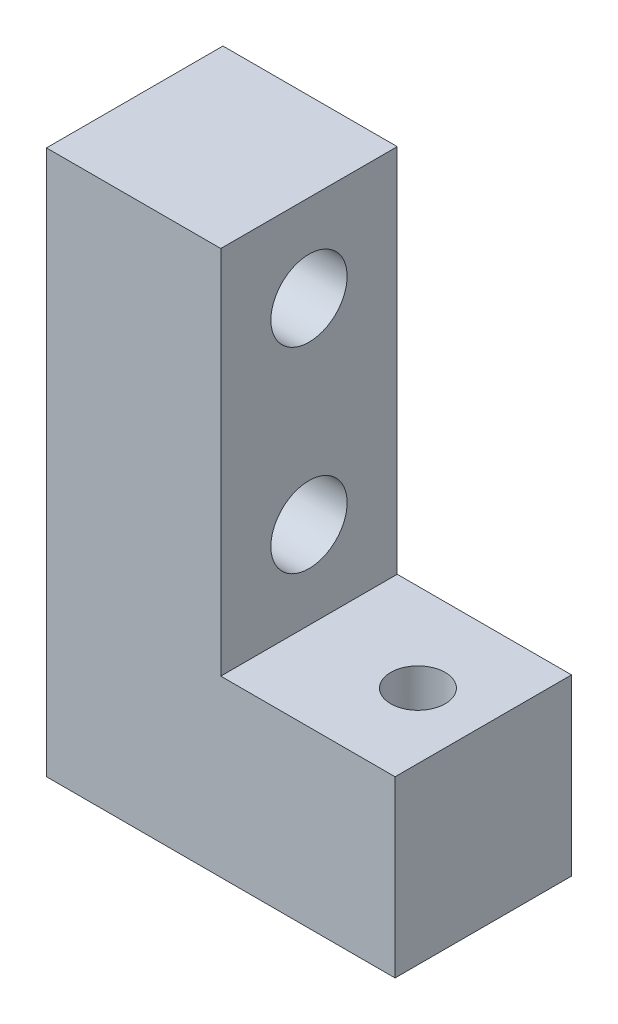
ISO-10303-21;
HEADER;
FILE_DESCRIPTION(('STEP AP214'),'2;1');
FILE_NAME('part.step','',(''),(''),'','','');
FILE_SCHEMA(('AUTOMOTIVE_DESIGN { 1 0 10303 214 1 1 1 1 }'));
ENDSEC;
DATA;
#1=APPLICATION_CONTEXT('core data for automotive mechanical design processes');
#2=APPLICATION_PROTOCOL_DEFINITION('international standard','automotive_design',2000,#1);
#3=PRODUCT_CONTEXT('',#1,'mechanical');
#4=PRODUCT('Part','Part','',(#3));
#5=PRODUCT_RELATED_PRODUCT_CATEGORY('part','',(#4));
#6=PRODUCT_DEFINITION_FORMATION('','',#4);
#7=PRODUCT_DEFINITION_CONTEXT('part definition',#1,'design');
#8=PRODUCT_DEFINITION('design','',#6,#7);
#9=PRODUCT_DEFINITION_SHAPE('','',#8);
#10=(LENGTH_UNIT() NAMED_UNIT(*) SI_UNIT(.MILLI.,.METRE.));
#11=(NAMED_UNIT(*) PLANE_ANGLE_UNIT() SI_UNIT($,.RADIAN.));
#12=(NAMED_UNIT(*) SI_UNIT($,.STERADIAN.) SOLID_ANGLE_UNIT());
#13=UNCERTAINTY_MEASURE_WITH_UNIT(LENGTH_MEASURE(1.E-05),#10,'distance_accuracy_value','');
#14=(GEOMETRIC_REPRESENTATION_CONTEXT(3) GLOBAL_UNCERTAINTY_ASSIGNED_CONTEXT((#13)) GLOBAL_UNIT_ASSIGNED_CONTEXT((#10,
#11,#12)) REPRESENTATION_CONTEXT('',''));
#15=CARTESIAN_POINT('',(0.,0.,0.));
#16=DIRECTION('',(0.,0.,1.));
#17=DIRECTION('',(1.,0.,0.));
#18=AXIS2_PLACEMENT_3D('',#15,#16,#17);
#19=CARTESIAN_POINT('',(0.,0.,8.1));
#20=DIRECTION('',(1.,0.,0.));
#21=DIRECTION('',(0.,0.,-1.));
#22=AXIS2_PLACEMENT_3D('',#19,#20,#21);
#23=PLANE('',#22);
#24=CARTESIAN_POINT('',(0.,12.,4.05));
#25=DIRECTION('',(-1.,0.,0.));
#26=DIRECTION('',(0.,0.,1.));
#27=AXIS2_PLACEMENT_3D('',#24,#25,#26);
#28=CIRCLE('',#27,1.75);
#29=CARTESIAN_POINT('',(0.,12.,5.8));
#30=VERTEX_POINT('',#29);
#31=EDGE_CURVE('E144',#30,#30,#28,.T.);
#32=ORIENTED_EDGE('',*,*,#31,.F.);
#33=EDGE_LOOP('',(#32));
#34=FACE_BOUND('',#33,.T.);
#35=CARTESIAN_POINT('',(0.,21.,4.05));
#36=DIRECTION('',(-1.,0.,0.));
#37=DIRECTION('',(0.,0.,1.));
#38=AXIS2_PLACEMENT_3D('',#35,#36,#37);
#39=CIRCLE('',#38,1.75);
#40=CARTESIAN_POINT('',(0.,21.,5.8));
#41=VERTEX_POINT('',#40);
#42=EDGE_CURVE('E147',#41,#41,#39,.T.);
#43=ORIENTED_EDGE('',*,*,#42,.F.);
#44=EDGE_LOOP('',(#43));
#45=FACE_BOUND('',#44,.T.);
#46=DIRECTION('',(0.,-1.,0.));
#47=VECTOR('',#46,1.);
#48=CARTESIAN_POINT('',(0.,0.,0.));
#49=LINE('',#48,#47);
#50=CARTESIAN_POINT('',(0.,25.,0.));
#51=VERTEX_POINT('',#50);
#52=CARTESIAN_POINT('',(0.,0.,0.));
#53=VERTEX_POINT('',#52);
#54=EDGE_CURVE('E108',#51,#53,#49,.T.);
#55=ORIENTED_EDGE('',*,*,#54,.T.);
#56=DIRECTION('',(0.,0.,-1.));
#57=VECTOR('',#56,1.);
#58=CARTESIAN_POINT('',(0.,0.,8.1));
#59=LINE('',#58,#57);
#60=CARTESIAN_POINT('',(0.,0.,8.1));
#61=VERTEX_POINT('',#60);
#62=EDGE_CURVE('E11',#61,#53,#59,.T.);
#63=ORIENTED_EDGE('',*,*,#62,.F.);
#64=DIRECTION('',(0.,-1.,0.));
#65=VECTOR('',#64,1.);
#66=CARTESIAN_POINT('',(0.,0.,8.1));
#67=LINE('',#66,#65);
#68=CARTESIAN_POINT('',(0.,25.,8.1));
#69=VERTEX_POINT('',#68);
#70=EDGE_CURVE('E109',#69,#61,#67,.T.);
#71=ORIENTED_EDGE('',*,*,#70,.F.);
#72=DIRECTION('',(0.,0.,-1.));
#73=VECTOR('',#72,1.);
#74=CARTESIAN_POINT('',(0.,25.,8.1));
#75=LINE('',#74,#73);
#76=EDGE_CURVE('E118',#69,#51,#75,.T.);
#77=ORIENTED_EDGE('',*,*,#76,.T.);
#78=EDGE_LOOP('',(#55,#63,#71,#77));
#79=FACE_BOUND('',#78,.T.);
#80=ADVANCED_FACE('F33',(#34,#45,#79),#23,.F.);
#81=CARTESIAN_POINT('',(0.,0.,8.1));
#82=DIRECTION('',(0.,1.,0.));
#83=DIRECTION('',(0.,0.,1.));
#84=AXIS2_PLACEMENT_3D('',#81,#82,#83);
#85=PLANE('',#84);
#86=CARTESIAN_POINT('',(13.,0.,4.05));
#87=DIRECTION('',(0.,-1.,0.));
#88=DIRECTION('',(0.,0.,1.));
#89=AXIS2_PLACEMENT_3D('',#86,#87,#88);
#90=CIRCLE('',#89,1.25);
#91=CARTESIAN_POINT('',(13.,0.,5.3));
#92=VERTEX_POINT('',#91);
#93=EDGE_CURVE('E150',#92,#92,#90,.T.);
#94=ORIENTED_EDGE('',*,*,#93,.F.);
#95=EDGE_LOOP('',(#94));
#96=FACE_BOUND('',#95,.T.);
#97=CARTESIAN_POINT('',(3.,0.,4.05));
#98=DIRECTION('',(0.,-1.,0.));
#99=DIRECTION('',(0.,0.,-1.));
#100=AXIS2_PLACEMENT_3D('',#97,#98,#99);
#101=CIRCLE('',#100,1.25);
#102=CARTESIAN_POINT('',(3.,0.,2.8));
#103=VERTEX_POINT('',#102);
#104=EDGE_CURVE('E153',#103,#103,#101,.T.);
#105=ORIENTED_EDGE('',*,*,#104,.F.);
#106=EDGE_LOOP('',(#105));
#107=FACE_BOUND('',#106,.T.);
#108=DIRECTION('',(1.,0.,0.));
#109=VECTOR('',#108,1.);
#110=CARTESIAN_POINT('',(0.,0.,0.));
#111=LINE('',#110,#109);
#112=CARTESIAN_POINT('',(16.,0.,0.));
#113=VERTEX_POINT('',#112);
#114=EDGE_CURVE('E114',#53,#113,#111,.T.);
#115=ORIENTED_EDGE('',*,*,#114,.T.);
#116=DIRECTION('',(0.,0.,-1.));
#117=VECTOR('',#116,1.);
#118=CARTESIAN_POINT('',(16.,0.,8.1));
#119=LINE('',#118,#117);
#120=CARTESIAN_POINT('',(16.,0.,8.1));
#121=VERTEX_POINT('',#120);
#122=EDGE_CURVE('E40',#121,#113,#119,.T.);
#123=ORIENTED_EDGE('',*,*,#122,.F.);
#124=DIRECTION('',(1.,0.,0.));
#125=VECTOR('',#124,1.);
#126=CARTESIAN_POINT('',(0.,0.,8.1));
#127=LINE('',#126,#125);
#128=EDGE_CURVE('E79',#61,#121,#127,.T.);
#129=ORIENTED_EDGE('',*,*,#128,.F.);
#130=ORIENTED_EDGE('',*,*,#62,.T.);
#131=EDGE_LOOP('',(#115,#123,#129,#130));
#132=FACE_BOUND('',#131,.T.);
#133=ADVANCED_FACE('F162',(#96,#107,#132),#85,.F.);
#134=CARTESIAN_POINT('',(16.,0.,8.1));
#135=DIRECTION('',(-1.,0.,0.));
#136=DIRECTION('',(0.,0.,1.));
#137=AXIS2_PLACEMENT_3D('',#134,#135,#136);
#138=PLANE('',#137);
#139=DIRECTION('',(0.,1.,0.));
#140=VECTOR('',#139,1.);
#141=CARTESIAN_POINT('',(16.,0.,0.));
#142=LINE('',#141,#140);
#143=CARTESIAN_POINT('',(16.,8.,0.));
#144=VERTEX_POINT('',#143);
#145=EDGE_CURVE('E110',#113,#144,#142,.T.);
#146=ORIENTED_EDGE('',*,*,#145,.T.);
#147=DIRECTION('',(0.,0.,1.));
#148=VECTOR('',#147,1.);
#149=CARTESIAN_POINT('',(16.,8.,0.));
#150=LINE('',#149,#148);
#151=CARTESIAN_POINT('',(16.,8.,8.1));
#152=VERTEX_POINT('',#151);
#153=EDGE_CURVE('E132',#144,#152,#150,.T.);
#154=ORIENTED_EDGE('',*,*,#153,.T.);
#155=DIRECTION('',(0.,1.,0.));
#156=VECTOR('',#155,1.);
#157=CARTESIAN_POINT('',(16.,0.,8.1));
#158=LINE('',#157,#156);
#159=EDGE_CURVE('E126',#121,#152,#158,.T.);
#160=ORIENTED_EDGE('',*,*,#159,.F.);
#161=ORIENTED_EDGE('',*,*,#122,.T.);
#162=EDGE_LOOP('',(#146,#154,#160,#161));
#163=FACE_BOUND('',#162,.T.);
#164=ADVANCED_FACE('F123',(#163),#138,.F.);
#165=CARTESIAN_POINT('',(0.,25.,8.1));
#166=DIRECTION('',(0.,-1.,0.));
#167=DIRECTION('',(0.,0.,-1.));
#168=AXIS2_PLACEMENT_3D('',#165,#166,#167);
#169=PLANE('',#168);
#170=DIRECTION('',(-1.,0.,0.));
#171=VECTOR('',#170,1.);
#172=CARTESIAN_POINT('',(0.,25.,8.1));
#173=LINE('',#172,#171);
#174=CARTESIAN_POINT('',(8.,25.,8.1));
#175=VERTEX_POINT('',#174);
#176=EDGE_CURVE('E56',#175,#69,#173,.T.);
#177=ORIENTED_EDGE('',*,*,#176,.F.);
#178=DIRECTION('',(0.,0.,1.));
#179=VECTOR('',#178,1.);
#180=CARTESIAN_POINT('',(8.,25.,0.));
#181=LINE('',#180,#179);
#182=CARTESIAN_POINT('',(8.,25.,0.));
#183=VERTEX_POINT('',#182);
#184=EDGE_CURVE('E98',#183,#175,#181,.T.);
#185=ORIENTED_EDGE('',*,*,#184,.F.);
#186=DIRECTION('',(-1.,0.,0.));
#187=VECTOR('',#186,1.);
#188=CARTESIAN_POINT('',(0.,25.,0.));
#189=LINE('',#188,#187);
#190=EDGE_CURVE('E74',#183,#51,#189,.T.);
#191=ORIENTED_EDGE('',*,*,#190,.T.);
#192=ORIENTED_EDGE('',*,*,#76,.F.);
#193=EDGE_LOOP('',(#177,#185,#191,#192));
#194=FACE_BOUND('',#193,.T.);
#195=ADVANCED_FACE('F103',(#194),#169,.F.);
#196=CARTESIAN_POINT('',(0.,0.,8.1));
#197=DIRECTION('',(0.,0.,-1.));
#198=DIRECTION('',(-1.,0.,0.));
#199=AXIS2_PLACEMENT_3D('',#196,#197,#198);
#200=PLANE('',#199);
#201=ORIENTED_EDGE('',*,*,#159,.T.);
#202=DIRECTION('',(1.,0.,0.));
#203=VECTOR('',#202,1.);
#204=CARTESIAN_POINT('',(16.,8.,8.1));
#205=LINE('',#204,#203);
#206=CARTESIAN_POINT('',(8.,8.,8.1));
#207=VERTEX_POINT('',#206);
#208=EDGE_CURVE('E101',#207,#152,#205,.T.);
#209=ORIENTED_EDGE('',*,*,#208,.F.);
#210=DIRECTION('',(0.,-1.,0.));
#211=VECTOR('',#210,1.);
#212=CARTESIAN_POINT('',(8.,25.,8.1));
#213=LINE('',#212,#211);
#214=EDGE_CURVE('E129',#175,#207,#213,.T.);
#215=ORIENTED_EDGE('',*,*,#214,.F.);
#216=ORIENTED_EDGE('',*,*,#176,.T.);
#217=ORIENTED_EDGE('',*,*,#70,.T.);
#218=ORIENTED_EDGE('',*,*,#128,.T.);
#219=EDGE_LOOP('',(#201,#209,#215,#216,#217,#218));
#220=FACE_BOUND('',#219,.T.);
#221=ADVANCED_FACE('F166',(#220),#200,.F.);
#222=CARTESIAN_POINT('',(0.,0.,0.));
#223=DIRECTION('',(0.,0.,-1.));
#224=DIRECTION('',(-1.,0.,0.));
#225=AXIS2_PLACEMENT_3D('',#222,#223,#224);
#226=PLANE('',#225);
#227=DIRECTION('',(1.,0.,0.));
#228=VECTOR('',#227,1.);
#229=CARTESIAN_POINT('',(16.,8.,0.));
#230=LINE('',#229,#228);
#231=CARTESIAN_POINT('',(8.,8.,0.));
#232=VERTEX_POINT('',#231);
#233=EDGE_CURVE('E47',#232,#144,#230,.T.);
#234=ORIENTED_EDGE('',*,*,#233,.T.);
#235=ORIENTED_EDGE('',*,*,#145,.F.);
#236=ORIENTED_EDGE('',*,*,#114,.F.);
#237=ORIENTED_EDGE('',*,*,#54,.F.);
#238=ORIENTED_EDGE('',*,*,#190,.F.);
#239=DIRECTION('',(0.,-1.,0.));
#240=VECTOR('',#239,1.);
#241=CARTESIAN_POINT('',(8.,25.,0.));
#242=LINE('',#241,#240);
#243=EDGE_CURVE('E94',#183,#232,#242,.T.);
#244=ORIENTED_EDGE('',*,*,#243,.T.);
#245=EDGE_LOOP('',(#234,#235,#236,#237,#238,#244));
#246=FACE_BOUND('',#245,.T.);
#247=ADVANCED_FACE('F106',(#246),#226,.T.);
#248=CARTESIAN_POINT('',(3.,8.,4.05));
#249=DIRECTION('',(0.,-1.,0.));
#250=DIRECTION('',(0.,0.,-1.));
#251=AXIS2_PLACEMENT_3D('',#248,#249,#250);
#252=CYLINDRICAL_SURFACE('',#251,1.25);
#253=CARTESIAN_POINT('',(3.,8.,4.05));
#254=DIRECTION('',(0.,-1.,0.));
#255=DIRECTION('',(0.,0.,-1.));
#256=AXIS2_PLACEMENT_3D('',#253,#254,#255);
#257=CIRCLE('',#256,1.25);
#258=CARTESIAN_POINT('',(3.,8.,2.8));
#259=VERTEX_POINT('',#258);
#260=EDGE_CURVE('E154',#259,#259,#257,.T.);
#261=ORIENTED_EDGE('',*,*,#260,.F.);
#262=EDGE_LOOP('',(#261));
#263=FACE_BOUND('',#262,.T.);
#264=ORIENTED_EDGE('',*,*,#104,.T.);
#265=EDGE_LOOP('',(#264));
#266=FACE_BOUND('',#265,.T.);
#267=ADVANCED_FACE('F187',(#263,#266),#252,.F.);
#268=CARTESIAN_POINT('',(3.,8.,4.05));
#269=DIRECTION('',(0.,-1.,0.));
#270=DIRECTION('',(0.,0.,-1.));
#271=AXIS2_PLACEMENT_3D('',#268,#269,#270);
#272=PLANE('',#271);
#273=ORIENTED_EDGE('',*,*,#260,.T.);
#274=EDGE_LOOP('',(#273));
#275=FACE_BOUND('',#274,.T.);
#276=ADVANCED_FACE('F179',(#275),#272,.T.);
#277=CARTESIAN_POINT('',(13.,8.,4.05));
#278=DIRECTION('',(0.,-1.,0.));
#279=DIRECTION('',(0.,0.,-1.));
#280=AXIS2_PLACEMENT_3D('',#277,#278,#279);
#281=CYLINDRICAL_SURFACE('',#280,1.25);
#282=CARTESIAN_POINT('',(13.,8.,4.05));
#283=DIRECTION('',(0.,-1.,0.));
#284=DIRECTION('',(1.,0.,0.));
#285=AXIS2_PLACEMENT_3D('',#282,#283,#284);
#286=CIRCLE('',#285,1.25);
#287=CARTESIAN_POINT('',(14.25,8.,4.05));
#288=VERTEX_POINT('',#287);
#289=EDGE_CURVE('E141',#288,#288,#286,.F.);
#290=ORIENTED_EDGE('',*,*,#289,.T.);
#291=EDGE_LOOP('',(#290));
#292=FACE_BOUND('',#291,.T.);
#293=ORIENTED_EDGE('',*,*,#93,.T.);
#294=EDGE_LOOP('',(#293));
#295=FACE_BOUND('',#294,.T.);
#296=ADVANCED_FACE('F175',(#292,#295),#281,.F.);
#297=CARTESIAN_POINT('',(8.,21.,4.05));
#298=DIRECTION('',(-1.,0.,0.));
#299=DIRECTION('',(0.,0.,1.));
#300=AXIS2_PLACEMENT_3D('',#297,#298,#299);
#301=CYLINDRICAL_SURFACE('',#300,1.75);
#302=CARTESIAN_POINT('',(8.,21.,4.05));
#303=DIRECTION('',(-1.,0.,0.));
#304=DIRECTION('',(0.,-1.,0.));
#305=AXIS2_PLACEMENT_3D('',#302,#303,#304);
#306=CIRCLE('',#305,1.75);
#307=CARTESIAN_POINT('',(8.,19.25,4.05));
#308=VERTEX_POINT('',#307);
#309=EDGE_CURVE('E138',#308,#308,#306,.F.);
#310=ORIENTED_EDGE('',*,*,#309,.T.);
#311=EDGE_LOOP('',(#310));
#312=FACE_BOUND('',#311,.T.);
#313=ORIENTED_EDGE('',*,*,#42,.T.);
#314=EDGE_LOOP('',(#313));
#315=FACE_BOUND('',#314,.T.);
#316=ADVANCED_FACE('F178',(#312,#315),#301,.F.);
#317=CARTESIAN_POINT('',(8.,12.,4.05));
#318=DIRECTION('',(-1.,0.,0.));
#319=DIRECTION('',(0.,0.,1.));
#320=AXIS2_PLACEMENT_3D('',#317,#318,#319);
#321=CYLINDRICAL_SURFACE('',#320,1.75);
#322=CARTESIAN_POINT('',(8.,12.,4.05));
#323=DIRECTION('',(-1.,0.,0.));
#324=DIRECTION('',(0.,-1.,0.));
#325=AXIS2_PLACEMENT_3D('',#322,#323,#324);
#326=CIRCLE('',#325,1.75);
#327=CARTESIAN_POINT('',(8.,10.25,4.05));
#328=VERTEX_POINT('',#327);
#329=EDGE_CURVE('E134',#328,#328,#326,.F.);
#330=ORIENTED_EDGE('',*,*,#329,.T.);
#331=EDGE_LOOP('',(#330));
#332=FACE_BOUND('',#331,.T.);
#333=ORIENTED_EDGE('',*,*,#31,.T.);
#334=EDGE_LOOP('',(#333));
#335=FACE_BOUND('',#334,.T.);
#336=ADVANCED_FACE('F171',(#332,#335),#321,.F.);
#337=CARTESIAN_POINT('',(16.,8.,0.));
#338=DIRECTION('',(0.,-1.,0.));
#339=DIRECTION('',(1.,0.,0.));
#340=AXIS2_PLACEMENT_3D('',#337,#338,#339);
#341=PLANE('',#340);
#342=ORIENTED_EDGE('',*,*,#208,.T.);
#343=ORIENTED_EDGE('',*,*,#153,.F.);
#344=ORIENTED_EDGE('',*,*,#233,.F.);
#345=DIRECTION('',(0.,0.,1.));
#346=VECTOR('',#345,1.);
#347=CARTESIAN_POINT('',(8.,8.,0.));
#348=LINE('',#347,#346);
#349=EDGE_CURVE('E99',#232,#207,#348,.T.);
#350=ORIENTED_EDGE('',*,*,#349,.T.);
#351=EDGE_LOOP('',(#342,#343,#344,#350));
#352=FACE_BOUND('',#351,.T.);
#353=ORIENTED_EDGE('',*,*,#289,.F.);
#354=EDGE_LOOP('',(#353));
#355=FACE_BOUND('',#354,.T.);
#356=ADVANCED_FACE('F168',(#352,#355),#341,.F.);
#357=CARTESIAN_POINT('',(8.,25.,0.));
#358=DIRECTION('',(-1.,0.,0.));
#359=DIRECTION('',(0.,-1.,0.));
#360=AXIS2_PLACEMENT_3D('',#357,#358,#359);
#361=PLANE('',#360);
#362=ORIENTED_EDGE('',*,*,#329,.F.);
#363=EDGE_LOOP('',(#362));
#364=FACE_BOUND('',#363,.T.);
#365=ORIENTED_EDGE('',*,*,#214,.T.);
#366=ORIENTED_EDGE('',*,*,#349,.F.);
#367=ORIENTED_EDGE('',*,*,#243,.F.);
#368=ORIENTED_EDGE('',*,*,#184,.T.);
#369=EDGE_LOOP('',(#365,#366,#367,#368));
#370=FACE_BOUND('',#369,.T.);
#371=ORIENTED_EDGE('',*,*,#309,.F.);
#372=EDGE_LOOP('',(#371));
#373=FACE_BOUND('',#372,.T.);
#374=ADVANCED_FACE('F96',(#364,#370,#373),#361,.F.);
#375=CLOSED_SHELL('',(#80,#133,#164,#195,#221,#247,#267,#276,#296,#316,#336,#356,#374));
#376=MANIFOLD_SOLID_BREP('B2',#375);
#377=ADVANCED_BREP_SHAPE_REPRESENTATION('',(#18,#376),#14);
#378=SHAPE_DEFINITION_REPRESENTATION(#9,#377);
ENDSEC;
END-ISO-10303-21;
